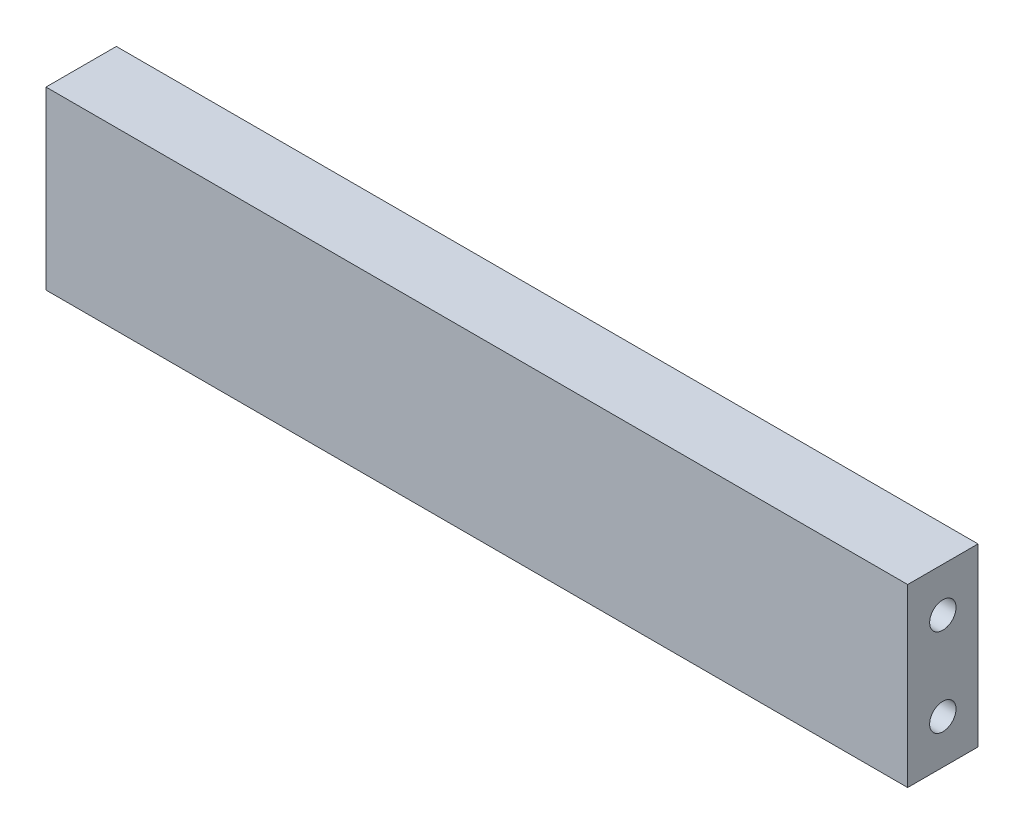
ISO-10303-21;
HEADER;
FILE_DESCRIPTION(('STEP AP214'),'2;1');
FILE_NAME('part.step','',(''),(''),'','','');
FILE_SCHEMA(('AUTOMOTIVE_DESIGN { 1 0 10303 214 1 1 1 1 }'));
ENDSEC;
DATA;
#1=APPLICATION_CONTEXT('core data for automotive mechanical design processes');
#2=APPLICATION_PROTOCOL_DEFINITION('international standard','automotive_design',2000,#1);
#3=PRODUCT_CONTEXT('',#1,'mechanical');
#4=PRODUCT('Part','Part','',(#3));
#5=PRODUCT_RELATED_PRODUCT_CATEGORY('part','',(#4));
#6=PRODUCT_DEFINITION_FORMATION('','',#4);
#7=PRODUCT_DEFINITION_CONTEXT('part definition',#1,'design');
#8=PRODUCT_DEFINITION('design','',#6,#7);
#9=PRODUCT_DEFINITION_SHAPE('','',#8);
#10=(LENGTH_UNIT() NAMED_UNIT(*) SI_UNIT(.MILLI.,.METRE.));
#11=(NAMED_UNIT(*) PLANE_ANGLE_UNIT() SI_UNIT($,.RADIAN.));
#12=(NAMED_UNIT(*) SI_UNIT($,.STERADIAN.) SOLID_ANGLE_UNIT());
#13=UNCERTAINTY_MEASURE_WITH_UNIT(LENGTH_MEASURE(1.E-05),#10,'distance_accuracy_value','');
#14=(GEOMETRIC_REPRESENTATION_CONTEXT(3) GLOBAL_UNCERTAINTY_ASSIGNED_CONTEXT((#13)) GLOBAL_UNIT_ASSIGNED_CONTEXT((#10,
#11,#12)) REPRESENTATION_CONTEXT('',''));
#15=CARTESIAN_POINT('',(0.,0.,0.));
#16=DIRECTION('',(0.,0.,1.));
#17=DIRECTION('',(1.,0.,0.));
#18=AXIS2_PLACEMENT_3D('',#15,#16,#17);
#19=CARTESIAN_POINT('',(-49.,10.,8.));
#20=DIRECTION('',(1.,0.,0.));
#21=DIRECTION('',(0.,1.,0.));
#22=AXIS2_PLACEMENT_3D('',#19,#20,#21);
#23=PLANE('',#22);
#24=CARTESIAN_POINT('',(-48.9999999999999,-5.00000000000003,4.));
#25=DIRECTION('',(-1.,0.,0.));
#26=DIRECTION('',(0.,0.,1.));
#27=AXIS2_PLACEMENT_3D('',#24,#25,#26);
#28=CIRCLE('',#27,1.5);
#29=CARTESIAN_POINT('',(-48.9999999999999,-5.00000000000003,5.5));
#30=VERTEX_POINT('',#29);
#31=EDGE_CURVE('E111',#30,#30,#28,.T.);
#32=ORIENTED_EDGE('',*,*,#31,.F.);
#33=EDGE_LOOP('',(#32));
#34=FACE_BOUND('',#33,.T.);
#35=DIRECTION('',(0.,-1.,0.));
#36=VECTOR('',#35,1.);
#37=CARTESIAN_POINT('',(-49.,10.,0.));
#38=LINE('',#37,#36);
#39=CARTESIAN_POINT('',(-49.,10.,0.));
#40=VERTEX_POINT('',#39);
#41=CARTESIAN_POINT('',(-49.,-9.99999999999996,0.));
#42=VERTEX_POINT('',#41);
#43=EDGE_CURVE('E116',#40,#42,#38,.T.);
#44=ORIENTED_EDGE('',*,*,#43,.T.);
#45=DIRECTION('',(0.,0.,-1.));
#46=VECTOR('',#45,1.);
#47=CARTESIAN_POINT('',(-49.,-9.99999999999996,8.));
#48=LINE('',#47,#46);
#49=CARTESIAN_POINT('',(-49.,-9.99999999999996,8.));
#50=VERTEX_POINT('',#49);
#51=EDGE_CURVE('E11',#50,#42,#48,.T.);
#52=ORIENTED_EDGE('',*,*,#51,.F.);
#53=DIRECTION('',(0.,-1.,0.));
#54=VECTOR('',#53,1.);
#55=CARTESIAN_POINT('',(-49.,10.,8.));
#56=LINE('',#55,#54);
#57=CARTESIAN_POINT('',(-49.,10.,8.));
#58=VERTEX_POINT('',#57);
#59=EDGE_CURVE('E175',#58,#50,#56,.T.);
#60=ORIENTED_EDGE('',*,*,#59,.F.);
#61=DIRECTION('',(0.,0.,-1.));
#62=VECTOR('',#61,1.);
#63=CARTESIAN_POINT('',(-49.,10.,8.));
#64=LINE('',#63,#62);
#65=EDGE_CURVE('E44',#58,#40,#64,.T.);
#66=ORIENTED_EDGE('',*,*,#65,.T.);
#67=EDGE_LOOP('',(#44,#52,#60,#66));
#68=FACE_BOUND('',#67,.T.);
#69=CARTESIAN_POINT('',(-48.9999999999999,4.99999999999994,4.));
#70=DIRECTION('',(-1.,0.,0.));
#71=DIRECTION('',(0.,0.,1.));
#72=AXIS2_PLACEMENT_3D('',#69,#70,#71);
#73=CIRCLE('',#72,1.5);
#74=CARTESIAN_POINT('',(-48.9999999999999,4.99999999999994,5.5));
#75=VERTEX_POINT('',#74);
#76=EDGE_CURVE('E120',#75,#75,#73,.T.);
#77=ORIENTED_EDGE('',*,*,#76,.F.);
#78=EDGE_LOOP('',(#77));
#79=FACE_BOUND('',#78,.T.);
#80=ADVANCED_FACE('F30',(#34,#68,#79),#23,.F.);
#81=CARTESIAN_POINT('',(49.,-10.,8.));
#82=DIRECTION('',(-1.,0.,0.));
#83=DIRECTION('',(0.,-1.,0.));
#84=AXIS2_PLACEMENT_3D('',#81,#82,#83);
#85=PLANE('',#84);
#86=CARTESIAN_POINT('',(49.,-5.,4.));
#87=DIRECTION('',(1.,0.,0.));
#88=DIRECTION('',(0.,0.,-1.));
#89=AXIS2_PLACEMENT_3D('',#86,#87,#88);
#90=CIRCLE('',#89,1.5);
#91=CARTESIAN_POINT('',(49.,-5.,2.5));
#92=VERTEX_POINT('',#91);
#93=EDGE_CURVE('E154',#92,#92,#90,.T.);
#94=ORIENTED_EDGE('',*,*,#93,.F.);
#95=EDGE_LOOP('',(#94));
#96=FACE_BOUND('',#95,.T.);
#97=DIRECTION('',(0.,1.,0.));
#98=VECTOR('',#97,1.);
#99=CARTESIAN_POINT('',(49.,-10.,0.));
#100=LINE('',#99,#98);
#101=CARTESIAN_POINT('',(49.,-10.,0.));
#102=VERTEX_POINT('',#101);
#103=CARTESIAN_POINT('',(49.,10.,0.));
#104=VERTEX_POINT('',#103);
#105=EDGE_CURVE('E169',#102,#104,#100,.T.);
#106=ORIENTED_EDGE('',*,*,#105,.T.);
#107=DIRECTION('',(0.,0.,-1.));
#108=VECTOR('',#107,1.);
#109=CARTESIAN_POINT('',(49.,10.,8.));
#110=LINE('',#109,#108);
#111=CARTESIAN_POINT('',(49.,10.,8.));
#112=VERTEX_POINT('',#111);
#113=EDGE_CURVE('E184',#112,#104,#110,.T.);
#114=ORIENTED_EDGE('',*,*,#113,.F.);
#115=DIRECTION('',(0.,1.,0.));
#116=VECTOR('',#115,1.);
#117=CARTESIAN_POINT('',(49.,-10.,8.));
#118=LINE('',#117,#116);
#119=CARTESIAN_POINT('',(49.,-10.,8.));
#120=VERTEX_POINT('',#119);
#121=EDGE_CURVE('E52',#120,#112,#118,.T.);
#122=ORIENTED_EDGE('',*,*,#121,.F.);
#123=DIRECTION('',(0.,0.,-1.));
#124=VECTOR('',#123,1.);
#125=CARTESIAN_POINT('',(49.,-10.,8.));
#126=LINE('',#125,#124);
#127=EDGE_CURVE('E37',#120,#102,#126,.T.);
#128=ORIENTED_EDGE('',*,*,#127,.T.);
#129=EDGE_LOOP('',(#106,#114,#122,#128));
#130=FACE_BOUND('',#129,.T.);
#131=CARTESIAN_POINT('',(49.,5.,4.));
#132=DIRECTION('',(1.,0.,0.));
#133=DIRECTION('',(0.,0.,-1.));
#134=AXIS2_PLACEMENT_3D('',#131,#132,#133);
#135=CIRCLE('',#134,1.5);
#136=CARTESIAN_POINT('',(49.,5.,2.5));
#137=VERTEX_POINT('',#136);
#138=EDGE_CURVE('E132',#137,#137,#135,.T.);
#139=ORIENTED_EDGE('',*,*,#138,.F.);
#140=EDGE_LOOP('',(#139));
#141=FACE_BOUND('',#140,.T.);
#142=ADVANCED_FACE('F100',(#96,#130,#141),#85,.F.);
#143=CARTESIAN_POINT('',(49.,-10.,8.));
#144=DIRECTION('',(0.,-1.,0.));
#145=DIRECTION('',(1.,0.,0.));
#146=AXIS2_PLACEMENT_3D('',#143,#144,#145);
#147=PLANE('',#146);
#148=DIRECTION('',(-1.,0.,0.));
#149=VECTOR('',#148,1.);
#150=CARTESIAN_POINT('',(49.,-10.,0.));
#151=LINE('',#150,#149);
#152=EDGE_CURVE('E167',#102,#42,#151,.T.);
#153=ORIENTED_EDGE('',*,*,#152,.F.);
#154=ORIENTED_EDGE('',*,*,#127,.F.);
#155=DIRECTION('',(-1.,0.,0.));
#156=VECTOR('',#155,1.);
#157=CARTESIAN_POINT('',(49.,-10.,8.));
#158=LINE('',#157,#156);
#159=EDGE_CURVE('E177',#120,#50,#158,.T.);
#160=ORIENTED_EDGE('',*,*,#159,.T.);
#161=ORIENTED_EDGE('',*,*,#51,.T.);
#162=EDGE_LOOP('',(#153,#154,#160,#161));
#163=FACE_BOUND('',#162,.T.);
#164=ADVANCED_FACE('F105',(#163),#147,.T.);
#165=CARTESIAN_POINT('',(-49.,10.,8.));
#166=DIRECTION('',(0.,1.,0.));
#167=DIRECTION('',(0.,0.,1.));
#168=AXIS2_PLACEMENT_3D('',#165,#166,#167);
#169=PLANE('',#168);
#170=DIRECTION('',(1.,0.,0.));
#171=VECTOR('',#170,1.);
#172=CARTESIAN_POINT('',(-49.,10.,0.));
#173=LINE('',#172,#171);
#174=EDGE_CURVE('E172',#40,#104,#173,.T.);
#175=ORIENTED_EDGE('',*,*,#174,.F.);
#176=ORIENTED_EDGE('',*,*,#65,.F.);
#177=DIRECTION('',(1.,0.,0.));
#178=VECTOR('',#177,1.);
#179=CARTESIAN_POINT('',(-49.,10.,8.));
#180=LINE('',#179,#178);
#181=EDGE_CURVE('E181',#58,#112,#180,.T.);
#182=ORIENTED_EDGE('',*,*,#181,.T.);
#183=ORIENTED_EDGE('',*,*,#113,.T.);
#184=EDGE_LOOP('',(#175,#176,#182,#183));
#185=FACE_BOUND('',#184,.T.);
#186=ADVANCED_FACE('F193',(#185),#169,.T.);
#187=CARTESIAN_POINT('',(-49.,10.,8.));
#188=DIRECTION('',(0.,0.,1.));
#189=DIRECTION('',(1.,0.,0.));
#190=AXIS2_PLACEMENT_3D('',#187,#188,#189);
#191=PLANE('',#190);
#192=ORIENTED_EDGE('',*,*,#59,.T.);
#193=ORIENTED_EDGE('',*,*,#159,.F.);
#194=ORIENTED_EDGE('',*,*,#121,.T.);
#195=ORIENTED_EDGE('',*,*,#181,.F.);
#196=EDGE_LOOP('',(#192,#193,#194,#195));
#197=FACE_BOUND('',#196,.T.);
#198=ADVANCED_FACE('F192',(#197),#191,.T.);
#199=CARTESIAN_POINT('',(-49.,10.,0.));
#200=DIRECTION('',(0.,0.,1.));
#201=DIRECTION('',(1.,0.,0.));
#202=AXIS2_PLACEMENT_3D('',#199,#200,#201);
#203=PLANE('',#202);
#204=ORIENTED_EDGE('',*,*,#43,.F.);
#205=ORIENTED_EDGE('',*,*,#174,.T.);
#206=ORIENTED_EDGE('',*,*,#105,.F.);
#207=ORIENTED_EDGE('',*,*,#152,.T.);
#208=EDGE_LOOP('',(#204,#205,#206,#207));
#209=FACE_BOUND('',#208,.T.);
#210=ADVANCED_FACE('F191',(#209),#203,.F.);
#211=CARTESIAN_POINT('',(37.5669872981078,-5.,4.));
#212=DIRECTION('',(1.,0.,0.));
#213=DIRECTION('',(0.,0.,-1.));
#214=AXIS2_PLACEMENT_3D('',#211,#212,#213);
#215=CONICAL_SURFACE('',#214,0.,1.0471975511966);
#216=CARTESIAN_POINT('',(38.,-5.,4.));
#217=DIRECTION('',(1.,0.,0.));
#218=DIRECTION('',(0.,0.,-1.));
#219=AXIS2_PLACEMENT_3D('',#216,#217,#218);
#220=CIRCLE('',#219,0.75);
#221=CARTESIAN_POINT('',(38.,-5.,3.25));
#222=VERTEX_POINT('',#221);
#223=EDGE_CURVE('E163',#222,#222,#220,.T.);
#224=ORIENTED_EDGE('',*,*,#223,.T.);
#225=EDGE_LOOP('',(#224));
#226=FACE_BOUND('',#225,.T.);
#227=CARTESIAN_POINT('',(37.5669872981078,-5.,4.));
#228=VERTEX_POINT('',#227);
#229=VERTEX_LOOP('',#228);
#230=FACE_BOUND('',#229,.T.);
#231=ADVANCED_FACE('F204',(#226,#230),#215,.F.);
#232=CARTESIAN_POINT('',(49.,-5.,4.));
#233=DIRECTION('',(1.,0.,0.));
#234=DIRECTION('',(0.,0.,-1.));
#235=AXIS2_PLACEMENT_3D('',#232,#233,#234);
#236=CYLINDRICAL_SURFACE('',#235,0.75);
#237=CARTESIAN_POINT('',(41.,-4.99999999999997,4.));
#238=DIRECTION('',(1.,0.,0.));
#239=DIRECTION('',(0.,0.,-1.));
#240=AXIS2_PLACEMENT_3D('',#237,#238,#239);
#241=CIRCLE('',#240,0.75);
#242=CARTESIAN_POINT('',(41.,-4.99999999999997,3.25));
#243=VERTEX_POINT('',#242);
#244=EDGE_CURVE('E160',#243,#243,#241,.T.);
#245=ORIENTED_EDGE('',*,*,#244,.T.);
#246=EDGE_LOOP('',(#245));
#247=FACE_BOUND('',#246,.T.);
#248=ORIENTED_EDGE('',*,*,#223,.F.);
#249=EDGE_LOOP('',(#248));
#250=FACE_BOUND('',#249,.T.);
#251=ADVANCED_FACE('F207',(#247,#250),#236,.F.);
#252=CARTESIAN_POINT('',(41.,-4.24999999999997,4.));
#253=DIRECTION('',(1.,0.,0.));
#254=DIRECTION('',(0.,0.,-1.));
#255=AXIS2_PLACEMENT_3D('',#252,#253,#254);
#256=PLANE('',#255);
#257=CARTESIAN_POINT('',(41.,-4.99999999999997,4.));
#258=DIRECTION('',(1.,0.,0.));
#259=DIRECTION('',(0.,0.,-1.));
#260=AXIS2_PLACEMENT_3D('',#257,#258,#259);
#261=CIRCLE('',#260,1.5);
#262=CARTESIAN_POINT('',(41.,-4.99999999999997,2.5));
#263=VERTEX_POINT('',#262);
#264=EDGE_CURVE('E157',#263,#263,#261,.T.);
#265=ORIENTED_EDGE('',*,*,#264,.T.);
#266=EDGE_LOOP('',(#265));
#267=FACE_BOUND('',#266,.T.);
#268=ORIENTED_EDGE('',*,*,#244,.F.);
#269=EDGE_LOOP('',(#268));
#270=FACE_BOUND('',#269,.T.);
#271=ADVANCED_FACE('F211',(#267,#270),#256,.T.);
#272=CARTESIAN_POINT('',(49.,-5.,4.));
#273=DIRECTION('',(1.,0.,0.));
#274=DIRECTION('',(0.,0.,-1.));
#275=AXIS2_PLACEMENT_3D('',#272,#273,#274);
#276=CYLINDRICAL_SURFACE('',#275,1.5);
#277=ORIENTED_EDGE('',*,*,#93,.T.);
#278=EDGE_LOOP('',(#277));
#279=FACE_BOUND('',#278,.T.);
#280=ORIENTED_EDGE('',*,*,#264,.F.);
#281=EDGE_LOOP('',(#280));
#282=FACE_BOUND('',#281,.T.);
#283=ADVANCED_FACE('F215',(#279,#282),#276,.F.);
#284=CARTESIAN_POINT('',(-37.5669872981077,-5.00000000000006,3.99999999999999));
#285=DIRECTION('',(-1.,0.,0.));
#286=DIRECTION('',(0.,0.,1.));
#287=AXIS2_PLACEMENT_3D('',#284,#285,#286);
#288=CONICAL_SURFACE('',#287,0.,1.0471975511966);
#289=CARTESIAN_POINT('',(-37.9999999999999,-5.00000000000006,3.99999999999999));
#290=DIRECTION('',(-1.,0.,0.));
#291=DIRECTION('',(0.,0.,1.));
#292=AXIS2_PLACEMENT_3D('',#289,#290,#291);
#293=CIRCLE('',#292,0.75);
#294=CARTESIAN_POINT('',(-37.9999999999999,-5.00000000000006,4.74999999999999));
#295=VERTEX_POINT('',#294);
#296=EDGE_CURVE('E151',#295,#295,#293,.T.);
#297=ORIENTED_EDGE('',*,*,#296,.T.);
#298=EDGE_LOOP('',(#297));
#299=FACE_BOUND('',#298,.T.);
#300=CARTESIAN_POINT('',(-37.5669872981077,-5.00000000000006,3.99999999999999));
#301=VERTEX_POINT('',#300);
#302=VERTEX_LOOP('',#301);
#303=FACE_BOUND('',#302,.T.);
#304=ADVANCED_FACE('F219',(#299,#303),#288,.F.);
#305=CARTESIAN_POINT('',(-48.9999999999999,-5.00000000000003,4.));
#306=DIRECTION('',(-1.,0.,0.));
#307=DIRECTION('',(0.,0.,1.));
#308=AXIS2_PLACEMENT_3D('',#305,#306,#307);
#309=CYLINDRICAL_SURFACE('',#308,0.75);
#310=CARTESIAN_POINT('',(-40.9999999999999,-5.00000000000005,4.));
#311=DIRECTION('',(-1.,0.,0.));
#312=DIRECTION('',(0.,0.,1.));
#313=AXIS2_PLACEMENT_3D('',#310,#311,#312);
#314=CIRCLE('',#313,0.75);
#315=CARTESIAN_POINT('',(-40.9999999999999,-5.00000000000005,4.75));
#316=VERTEX_POINT('',#315);
#317=EDGE_CURVE('E148',#316,#316,#314,.T.);
#318=ORIENTED_EDGE('',*,*,#317,.T.);
#319=EDGE_LOOP('',(#318));
#320=FACE_BOUND('',#319,.T.);
#321=ORIENTED_EDGE('',*,*,#296,.F.);
#322=EDGE_LOOP('',(#321));
#323=FACE_BOUND('',#322,.T.);
#324=ADVANCED_FACE('F223',(#320,#323),#309,.F.);
#325=CARTESIAN_POINT('',(-40.9999999999999,-4.25000000000006,4.));
#326=DIRECTION('',(-1.,0.,0.));
#327=DIRECTION('',(0.,0.,1.));
#328=AXIS2_PLACEMENT_3D('',#325,#326,#327);
#329=PLANE('',#328);
#330=CARTESIAN_POINT('',(-40.9999999999999,-5.00000000000005,4.));
#331=DIRECTION('',(-1.,0.,0.));
#332=DIRECTION('',(0.,0.,1.));
#333=AXIS2_PLACEMENT_3D('',#330,#331,#332);
#334=CIRCLE('',#333,1.5);
#335=CARTESIAN_POINT('',(-40.9999999999999,-5.00000000000005,5.5));
#336=VERTEX_POINT('',#335);
#337=EDGE_CURVE('E145',#336,#336,#334,.T.);
#338=ORIENTED_EDGE('',*,*,#337,.T.);
#339=EDGE_LOOP('',(#338));
#340=FACE_BOUND('',#339,.T.);
#341=ORIENTED_EDGE('',*,*,#317,.F.);
#342=EDGE_LOOP('',(#341));
#343=FACE_BOUND('',#342,.T.);
#344=ADVANCED_FACE('F227',(#340,#343),#329,.T.);
#345=CARTESIAN_POINT('',(-48.9999999999999,-5.00000000000003,4.));
#346=DIRECTION('',(-1.,0.,0.));
#347=DIRECTION('',(0.,0.,1.));
#348=AXIS2_PLACEMENT_3D('',#345,#346,#347);
#349=CYLINDRICAL_SURFACE('',#348,1.5);
#350=ORIENTED_EDGE('',*,*,#31,.T.);
#351=EDGE_LOOP('',(#350));
#352=FACE_BOUND('',#351,.T.);
#353=ORIENTED_EDGE('',*,*,#337,.F.);
#354=EDGE_LOOP('',(#353));
#355=FACE_BOUND('',#354,.T.);
#356=ADVANCED_FACE('F231',(#352,#355),#349,.F.);
#357=CARTESIAN_POINT('',(37.5669872981078,5.00000000000002,4.));
#358=DIRECTION('',(1.,0.,0.));
#359=DIRECTION('',(0.,0.,-1.));
#360=AXIS2_PLACEMENT_3D('',#357,#358,#359);
#361=CONICAL_SURFACE('',#360,0.,1.0471975511966);
#362=CARTESIAN_POINT('',(38.,5.00000000000002,4.));
#363=DIRECTION('',(1.,0.,0.));
#364=DIRECTION('',(0.,0.,-1.));
#365=AXIS2_PLACEMENT_3D('',#362,#363,#364);
#366=CIRCLE('',#365,0.75);
#367=CARTESIAN_POINT('',(38.,5.00000000000002,3.25));
#368=VERTEX_POINT('',#367);
#369=EDGE_CURVE('E141',#368,#368,#366,.T.);
#370=ORIENTED_EDGE('',*,*,#369,.T.);
#371=EDGE_LOOP('',(#370));
#372=FACE_BOUND('',#371,.T.);
#373=CARTESIAN_POINT('',(37.5669872981078,5.00000000000002,4.));
#374=VERTEX_POINT('',#373);
#375=VERTEX_LOOP('',#374);
#376=FACE_BOUND('',#375,.T.);
#377=ADVANCED_FACE('F235',(#372,#376),#361,.F.);
#378=CARTESIAN_POINT('',(49.,5.,4.));
#379=DIRECTION('',(1.,0.,0.));
#380=DIRECTION('',(0.,0.,-1.));
#381=AXIS2_PLACEMENT_3D('',#378,#379,#380);
#382=CYLINDRICAL_SURFACE('',#381,0.75);
#383=CARTESIAN_POINT('',(41.,5.,4.));
#384=DIRECTION('',(1.,0.,0.));
#385=DIRECTION('',(0.,0.,-1.));
#386=AXIS2_PLACEMENT_3D('',#383,#384,#385);
#387=CIRCLE('',#386,0.75);
#388=CARTESIAN_POINT('',(41.,5.,3.25));
#389=VERTEX_POINT('',#388);
#390=EDGE_CURVE('E138',#389,#389,#387,.T.);
#391=ORIENTED_EDGE('',*,*,#390,.T.);
#392=EDGE_LOOP('',(#391));
#393=FACE_BOUND('',#392,.T.);
#394=ORIENTED_EDGE('',*,*,#369,.F.);
#395=EDGE_LOOP('',(#394));
#396=FACE_BOUND('',#395,.T.);
#397=ADVANCED_FACE('F239',(#393,#396),#382,.F.);
#398=CARTESIAN_POINT('',(41.,5.75,4.));
#399=DIRECTION('',(1.,0.,0.));
#400=DIRECTION('',(0.,0.,-1.));
#401=AXIS2_PLACEMENT_3D('',#398,#399,#400);
#402=PLANE('',#401);
#403=CARTESIAN_POINT('',(41.,5.,4.));
#404=DIRECTION('',(1.,0.,0.));
#405=DIRECTION('',(0.,0.,-1.));
#406=AXIS2_PLACEMENT_3D('',#403,#404,#405);
#407=CIRCLE('',#406,1.5);
#408=CARTESIAN_POINT('',(41.,5.,2.5));
#409=VERTEX_POINT('',#408);
#410=EDGE_CURVE('E135',#409,#409,#407,.T.);
#411=ORIENTED_EDGE('',*,*,#410,.T.);
#412=EDGE_LOOP('',(#411));
#413=FACE_BOUND('',#412,.T.);
#414=ORIENTED_EDGE('',*,*,#390,.F.);
#415=EDGE_LOOP('',(#414));
#416=FACE_BOUND('',#415,.T.);
#417=ADVANCED_FACE('F95',(#413,#416),#402,.T.);
#418=CARTESIAN_POINT('',(49.,5.,4.));
#419=DIRECTION('',(1.,0.,0.));
#420=DIRECTION('',(0.,0.,-1.));
#421=AXIS2_PLACEMENT_3D('',#418,#419,#420);
#422=CYLINDRICAL_SURFACE('',#421,1.5);
#423=ORIENTED_EDGE('',*,*,#138,.T.);
#424=EDGE_LOOP('',(#423));
#425=FACE_BOUND('',#424,.T.);
#426=ORIENTED_EDGE('',*,*,#410,.F.);
#427=EDGE_LOOP('',(#426));
#428=FACE_BOUND('',#427,.T.);
#429=ADVANCED_FACE('F85',(#425,#428),#422,.F.);
#430=CARTESIAN_POINT('',(-37.5669872981077,4.99999999999995,3.99999999999999));
#431=DIRECTION('',(-1.,0.,0.));
#432=DIRECTION('',(0.,0.,1.));
#433=AXIS2_PLACEMENT_3D('',#430,#431,#432);
#434=CONICAL_SURFACE('',#433,0.,1.0471975511966);
#435=CARTESIAN_POINT('',(-37.9999999999999,4.99999999999995,3.99999999999999));
#436=DIRECTION('',(-1.,0.,0.));
#437=DIRECTION('',(0.,0.,1.));
#438=AXIS2_PLACEMENT_3D('',#435,#436,#437);
#439=CIRCLE('',#438,0.75);
#440=CARTESIAN_POINT('',(-37.9999999999999,4.99999999999995,4.74999999999999));
#441=VERTEX_POINT('',#440);
#442=EDGE_CURVE('E130',#441,#441,#439,.T.);
#443=ORIENTED_EDGE('',*,*,#442,.T.);
#444=EDGE_LOOP('',(#443));
#445=FACE_BOUND('',#444,.T.);
#446=CARTESIAN_POINT('',(-37.5669872981077,4.99999999999995,3.99999999999999));
#447=VERTEX_POINT('',#446);
#448=VERTEX_LOOP('',#447);
#449=FACE_BOUND('',#448,.T.);
#450=ADVANCED_FACE('F82',(#445,#449),#434,.F.);
#451=CARTESIAN_POINT('',(-48.9999999999999,4.99999999999994,4.));
#452=DIRECTION('',(-1.,0.,0.));
#453=DIRECTION('',(0.,0.,1.));
#454=AXIS2_PLACEMENT_3D('',#451,#452,#453);
#455=CYLINDRICAL_SURFACE('',#454,0.75);
#456=CARTESIAN_POINT('',(-40.9999999999999,4.99999999999994,4.));
#457=DIRECTION('',(-1.,0.,0.));
#458=DIRECTION('',(0.,0.,1.));
#459=AXIS2_PLACEMENT_3D('',#456,#457,#458);
#460=CIRCLE('',#459,0.75);
#461=CARTESIAN_POINT('',(-40.9999999999999,4.99999999999994,4.75));
#462=VERTEX_POINT('',#461);
#463=EDGE_CURVE('E125',#462,#462,#460,.T.);
#464=ORIENTED_EDGE('',*,*,#463,.T.);
#465=EDGE_LOOP('',(#464));
#466=FACE_BOUND('',#465,.T.);
#467=ORIENTED_EDGE('',*,*,#442,.F.);
#468=EDGE_LOOP('',(#467));
#469=FACE_BOUND('',#468,.T.);
#470=ADVANCED_FACE('F84',(#466,#469),#455,.F.);
#471=CARTESIAN_POINT('',(-40.9999999999999,5.74999999999994,4.));
#472=DIRECTION('',(-1.,0.,0.));
#473=DIRECTION('',(0.,0.,1.));
#474=AXIS2_PLACEMENT_3D('',#471,#472,#473);
#475=PLANE('',#474);
#476=CARTESIAN_POINT('',(-40.9999999999999,4.99999999999994,4.));
#477=DIRECTION('',(-1.,0.,0.));
#478=DIRECTION('',(0.,0.,1.));
#479=AXIS2_PLACEMENT_3D('',#476,#477,#478);
#480=CIRCLE('',#479,1.5);
#481=CARTESIAN_POINT('',(-40.9999999999999,4.99999999999994,5.5));
#482=VERTEX_POINT('',#481);
#483=EDGE_CURVE('E122',#482,#482,#480,.T.);
#484=ORIENTED_EDGE('',*,*,#483,.T.);
#485=EDGE_LOOP('',(#484));
#486=FACE_BOUND('',#485,.T.);
#487=ORIENTED_EDGE('',*,*,#463,.F.);
#488=EDGE_LOOP('',(#487));
#489=FACE_BOUND('',#488,.T.);
#490=ADVANCED_FACE('F92',(#486,#489),#475,.T.);
#491=CARTESIAN_POINT('',(-48.9999999999999,4.99999999999994,4.));
#492=DIRECTION('',(-1.,0.,0.));
#493=DIRECTION('',(0.,0.,1.));
#494=AXIS2_PLACEMENT_3D('',#491,#492,#493);
#495=CYLINDRICAL_SURFACE('',#494,1.5);
#496=ORIENTED_EDGE('',*,*,#76,.T.);
#497=EDGE_LOOP('',(#496));
#498=FACE_BOUND('',#497,.T.);
#499=ORIENTED_EDGE('',*,*,#483,.F.);
#500=EDGE_LOOP('',(#499));
#501=FACE_BOUND('',#500,.T.);
#502=ADVANCED_FACE('F281',(#498,#501),#495,.F.);
#503=CLOSED_SHELL('',(#80,#142,#164,#186,#198,#210,#231,#251,#271,#283,#304,#324,#344,#356,#377,
#397,#417,#429,#450,#470,#490,#502));
#504=MANIFOLD_SOLID_BREP('B2',#503);
#505=ADVANCED_BREP_SHAPE_REPRESENTATION('',(#18,#504),#14);
#506=SHAPE_DEFINITION_REPRESENTATION(#9,#505);
ENDSEC;
END-ISO-10303-21;
